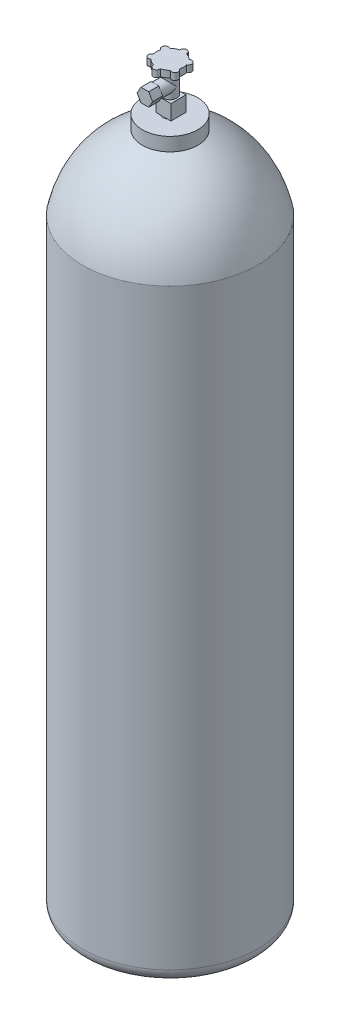
ISO-10303-21;
HEADER;
FILE_DESCRIPTION(('STEP AP214'),'2;1');
FILE_NAME('part.step','',(''),(''),'','','');
FILE_SCHEMA(('AUTOMOTIVE_DESIGN { 1 0 10303 214 1 1 1 1 }'));
ENDSEC;
DATA;
#1=APPLICATION_CONTEXT('core data for automotive mechanical design processes');
#2=APPLICATION_PROTOCOL_DEFINITION('international standard','automotive_design',2000,#1);
#3=PRODUCT_CONTEXT('',#1,'mechanical');
#4=PRODUCT('Part','Part','',(#3));
#5=PRODUCT_RELATED_PRODUCT_CATEGORY('part','',(#4));
#6=PRODUCT_DEFINITION_FORMATION('','',#4);
#7=PRODUCT_DEFINITION_CONTEXT('part definition',#1,'design');
#8=PRODUCT_DEFINITION('design','',#6,#7);
#9=PRODUCT_DEFINITION_SHAPE('','',#8);
#10=(LENGTH_UNIT() NAMED_UNIT(*) SI_UNIT(.MILLI.,.METRE.));
#11=(NAMED_UNIT(*) PLANE_ANGLE_UNIT() SI_UNIT($,.RADIAN.));
#12=(NAMED_UNIT(*) SI_UNIT($,.STERADIAN.) SOLID_ANGLE_UNIT());
#13=UNCERTAINTY_MEASURE_WITH_UNIT(LENGTH_MEASURE(1.E-05),#10,'distance_accuracy_value','');
#14=(GEOMETRIC_REPRESENTATION_CONTEXT(3) GLOBAL_UNCERTAINTY_ASSIGNED_CONTEXT((#13)) GLOBAL_UNIT_ASSIGNED_CONTEXT((#10,
#11,#12)) REPRESENTATION_CONTEXT('',''));
#15=CARTESIAN_POINT('',(0.,0.,0.));
#16=DIRECTION('',(0.,0.,1.));
#17=DIRECTION('',(1.,0.,0.));
#18=AXIS2_PLACEMENT_3D('',#15,#16,#17);
#19=CARTESIAN_POINT('',(0.,0.,0.));
#20=DIRECTION('',(0.,-1.,0.));
#21=DIRECTION('',(0.,0.,-1.));
#22=AXIS2_PLACEMENT_3D('',#19,#20,#21);
#23=CYLINDRICAL_SURFACE('',#22,12.7);
#24=CARTESIAN_POINT('',(0.,1339.85,0.));
#25=DIRECTION('',(0.,-1.,0.));
#26=DIRECTION('',(0.,0.,-1.));
#27=AXIS2_PLACEMENT_3D('',#24,#25,#26);
#28=CIRCLE('',#27,12.7);
#29=CARTESIAN_POINT('',(-12.7,1339.85,0.));
#30=VERTEX_POINT('',#29);
#31=EDGE_CURVE('E457',#30,#30,#28,.F.);
#32=ORIENTED_EDGE('',*,*,#31,.T.);
#33=EDGE_LOOP('',(#32));
#34=FACE_BOUND('',#33,.T.);
#35=CARTESIAN_POINT('',(0.,1384.3,0.));
#36=DIRECTION('',(0.,-1.,0.));
#37=DIRECTION('',(0.,0.,-1.));
#38=AXIS2_PLACEMENT_3D('',#35,#36,#37);
#39=CIRCLE('',#38,12.6999999999999);
#40=CARTESIAN_POINT('',(0.,1384.3,-12.6999999999999));
#41=VERTEX_POINT('',#40);
#42=EDGE_CURVE('E429',#41,#41,#39,.T.);
#43=ORIENTED_EDGE('',*,*,#42,.T.);
#44=EDGE_LOOP('',(#43));
#45=FACE_BOUND('',#44,.T.);
#46=CARTESIAN_POINT('',(0.,1358.9,0.));
#47=DIRECTION('',(0.,-0.707106781186547,0.707106781186547));
#48=DIRECTION('',(0.,-0.707106781186547,-0.707106781186547));
#49=AXIS2_PLACEMENT_3D('',#46,#47,#48);
#50=ELLIPSE('',#49,17.9605122421383,12.7);
#51=CARTESIAN_POINT('',(-12.7,1358.9,0.));
#52=VERTEX_POINT('',#51);
#53=CARTESIAN_POINT('',(12.7,1358.9,0.));
#54=VERTEX_POINT('',#53);
#55=EDGE_CURVE('E460',#52,#54,#50,.F.);
#56=ORIENTED_EDGE('',*,*,#55,.T.);
#57=CARTESIAN_POINT('',(0.,1358.9,0.));
#58=DIRECTION('',(0.,-0.707106781186547,-0.707106781186547));
#59=DIRECTION('',(0.,-0.707106781186547,0.707106781186547));
#60=AXIS2_PLACEMENT_3D('',#57,#58,#59);
#61=ELLIPSE('',#60,17.9605122421383,12.7);
#62=EDGE_CURVE('E463',#54,#52,#61,.T.);
#63=ORIENTED_EDGE('',*,*,#62,.T.);
#64=EDGE_LOOP('',(#56,#63));
#65=FACE_BOUND('',#64,.T.);
#66=ADVANCED_FACE('F36',(#34,#45,#65),#23,.T.);
#67=CARTESIAN_POINT('',(0.,1308.1,0.));
#68=DIRECTION('',(0.,-1.,0.));
#69=DIRECTION('',(0.,0.,-1.));
#70=AXIS2_PLACEMENT_3D('',#67,#68,#69);
#71=CIRCLE('',#70,12.7);
#72=CARTESIAN_POINT('',(0.,1308.1,-12.7));
#73=VERTEX_POINT('',#72);
#74=EDGE_CURVE('E433',#73,#73,#71,.T.);
#75=ORIENTED_EDGE('',*,*,#74,.F.);
#76=EDGE_LOOP('',(#75));
#77=FACE_BOUND('',#76,.T.);
#78=CARTESIAN_POINT('',(0.,1311.275,0.));
#79=DIRECTION('',(0.,1.,0.));
#80=DIRECTION('',(0.,0.,1.));
#81=AXIS2_PLACEMENT_3D('',#78,#79,#80);
#82=CIRCLE('',#81,12.7);
#83=CARTESIAN_POINT('',(-12.7,1311.275,0.));
#84=VERTEX_POINT('',#83);
#85=EDGE_CURVE('E413',#84,#84,#82,.F.);
#86=ORIENTED_EDGE('',*,*,#85,.T.);
#87=EDGE_LOOP('',(#86));
#88=FACE_BOUND('',#87,.T.);
#89=ADVANCED_FACE('F377',(#77,#88),#23,.T.);
#90=CARTESIAN_POINT('',(12.7,1308.1,0.));
#91=DIRECTION('',(0.,1.,0.));
#92=DIRECTION('',(0.,0.,1.));
#93=AXIS2_PLACEMENT_3D('',#90,#91,#92);
#94=PLANE('',#93);
#95=ORIENTED_EDGE('',*,*,#74,.T.);
#96=EDGE_LOOP('',(#95));
#97=FACE_BOUND('',#96,.T.);
#98=CARTESIAN_POINT('',(0.,1308.1,0.));
#99=DIRECTION('',(0.,-1.,0.));
#100=DIRECTION('',(0.,0.,-1.));
#101=AXIS2_PLACEMENT_3D('',#98,#99,#100);
#102=CIRCLE('',#101,52.3216166566241);
#103=CARTESIAN_POINT('',(0.,1308.1,-52.3216166566241));
#104=VERTEX_POINT('',#103);
#105=EDGE_CURVE('E486',#104,#104,#102,.T.);
#106=ORIENTED_EDGE('',*,*,#105,.F.);
#107=EDGE_LOOP('',(#106));
#108=FACE_BOUND('',#107,.T.);
#109=ADVANCED_FACE('F373',(#97,#108),#94,.T.);
#110=CARTESIAN_POINT('',(0.,0.,0.));
#111=DIRECTION('',(0.,-1.,0.));
#112=DIRECTION('',(0.,0.,-1.));
#113=AXIS2_PLACEMENT_3D('',#110,#111,#112);
#114=CYLINDRICAL_SURFACE('',#113,52.3216166566241);
#115=ORIENTED_EDGE('',*,*,#105,.T.);
#116=EDGE_LOOP('',(#115));
#117=FACE_BOUND('',#116,.T.);
#118=CARTESIAN_POINT('',(0.,1282.7,0.));
#119=DIRECTION('',(0.,-1.,0.));
#120=DIRECTION('',(0.,0.,-1.));
#121=AXIS2_PLACEMENT_3D('',#118,#119,#120);
#122=CIRCLE('',#121,52.3216166566241);
#123=CARTESIAN_POINT('',(0.,1282.7,-52.3216166566241));
#124=VERTEX_POINT('',#123);
#125=EDGE_CURVE('E484',#124,#124,#122,.T.);
#126=ORIENTED_EDGE('',*,*,#125,.F.);
#127=EDGE_LOOP('',(#126));
#128=FACE_BOUND('',#127,.T.);
#129=ADVANCED_FACE('F368',(#117,#128),#114,.T.);
#130=CARTESIAN_POINT('',(165.1,1143.,0.));
#131=CARTESIAN_POINT('',(143.698147325174,1240.08378947044,0.));
#132=CARTESIAN_POINT('',(52.3216166566241,1282.7,0.));
#133=B_SPLINE_CURVE_WITH_KNOTS('',2,(#130,#131,#132),.UNSPECIFIED.,.F.,.F.,(3,3),(0.,1.),.UNSPECIFIED.);
#134=CARTESIAN_POINT('',(0.,0.,0.));
#135=DIRECTION('',(0.,-1.,0.));
#136=AXIS1_PLACEMENT('',#134,#135);
#137=SURFACE_OF_REVOLUTION('',#133,#136);
#138=ORIENTED_EDGE('',*,*,#125,.T.);
#139=EDGE_LOOP('',(#138));
#140=FACE_BOUND('',#139,.T.);
#141=CARTESIAN_POINT('',(0.,1143.,0.));
#142=DIRECTION('',(0.,-1.,0.));
#143=DIRECTION('',(0.,0.,-1.));
#144=AXIS2_PLACEMENT_3D('',#141,#142,#143);
#145=CIRCLE('',#144,165.1);
#146=CARTESIAN_POINT('',(0.,1143.,-165.1));
#147=VERTEX_POINT('',#146);
#148=EDGE_CURVE('E321',#147,#147,#145,.T.);
#149=ORIENTED_EDGE('',*,*,#148,.F.);
#150=EDGE_LOOP('',(#149));
#151=FACE_BOUND('',#150,.T.);
#152=ADVANCED_FACE('F363',(#140,#151),#137,.F.);
#153=CARTESIAN_POINT('',(0.,0.,0.));
#154=DIRECTION('',(0.,-1.,0.));
#155=DIRECTION('',(0.,0.,-1.));
#156=AXIS2_PLACEMENT_3D('',#153,#154,#155);
#157=CYLINDRICAL_SURFACE('',#156,165.1);
#158=CARTESIAN_POINT('',(0.,25.4,0.));
#159=DIRECTION('',(0.,-1.,0.));
#160=DIRECTION('',(0.,0.,-1.));
#161=AXIS2_PLACEMENT_3D('',#158,#159,#160);
#162=CIRCLE('',#161,165.1);
#163=CARTESIAN_POINT('',(0.,25.4,-165.1));
#164=VERTEX_POINT('',#163);
#165=EDGE_CURVE('E11',#164,#164,#162,.F.);
#166=ORIENTED_EDGE('',*,*,#165,.T.);
#167=EDGE_LOOP('',(#166));
#168=FACE_BOUND('',#167,.T.);
#169=ORIENTED_EDGE('',*,*,#148,.T.);
#170=EDGE_LOOP('',(#169));
#171=FACE_BOUND('',#170,.T.);
#172=ADVANCED_FACE('F367',(#168,#171),#157,.T.);
#173=CARTESIAN_POINT('',(0.,0.,0.));
#174=DIRECTION('',(0.,-1.,0.));
#175=DIRECTION('',(0.,0.,-1.));
#176=AXIS2_PLACEMENT_3D('',#173,#174,#175);
#177=PLANE('',#176);
#178=CARTESIAN_POINT('',(0.,0.,0.));
#179=DIRECTION('',(0.,-1.,0.));
#180=DIRECTION('',(0.,0.,-1.));
#181=AXIS2_PLACEMENT_3D('',#178,#179,#180);
#182=CIRCLE('',#181,139.7);
#183=CARTESIAN_POINT('',(0.,0.,-139.7));
#184=VERTEX_POINT('',#183);
#185=EDGE_CURVE('E44',#184,#184,#182,.T.);
#186=ORIENTED_EDGE('',*,*,#185,.T.);
#187=EDGE_LOOP('',(#186));
#188=FACE_BOUND('',#187,.T.);
#189=ADVANCED_FACE('F468',(#188),#177,.T.);
#190=CARTESIAN_POINT('',(-12.7,0.,0.));
#191=DIRECTION('',(-1.,0.,0.));
#192=DIRECTION('',(0.,0.,1.));
#193=AXIS2_PLACEMENT_3D('',#190,#191,#192);
#194=PLANE('',#193);
#195=DIRECTION('',(0.,0.,1.));
#196=VECTOR('',#195,1.);
#197=CARTESIAN_POINT('',(-12.7,1339.85,14.2875));
#198=LINE('',#197,#196);
#199=CARTESIAN_POINT('',(-12.7,1339.85,14.2875));
#200=VERTEX_POINT('',#199);
#201=EDGE_CURVE('E263',#30,#200,#198,.T.);
#202=ORIENTED_EDGE('',*,*,#201,.F.);
#203=CARTESIAN_POINT('',(-12.7,1339.85,-14.2875));
#204=VERTEX_POINT('',#203);
#205=EDGE_CURVE('E264',#204,#30,#198,.T.);
#206=ORIENTED_EDGE('',*,*,#205,.F.);
#207=DIRECTION('',(0.,1.,0.));
#208=VECTOR('',#207,1.);
#209=CARTESIAN_POINT('',(-12.7,1311.275,-14.2875));
#210=LINE('',#209,#208);
#211=CARTESIAN_POINT('',(-12.7,1311.275,-14.2875));
#212=VERTEX_POINT('',#211);
#213=EDGE_CURVE('E248',#212,#204,#210,.T.);
#214=ORIENTED_EDGE('',*,*,#213,.F.);
#215=DIRECTION('',(0.,0.,-1.));
#216=VECTOR('',#215,1.);
#217=CARTESIAN_POINT('',(-12.7,1311.275,14.2875));
#218=LINE('',#217,#216);
#219=EDGE_CURVE('E268',#84,#212,#218,.T.);
#220=ORIENTED_EDGE('',*,*,#219,.F.);
#221=CARTESIAN_POINT('',(-12.7,1311.275,14.2875));
#222=VERTEX_POINT('',#221);
#223=EDGE_CURVE('E254',#222,#84,#218,.T.);
#224=ORIENTED_EDGE('',*,*,#223,.F.);
#225=DIRECTION('',(0.,-1.,0.));
#226=VECTOR('',#225,1.);
#227=CARTESIAN_POINT('',(-12.7,1311.275,14.2875));
#228=LINE('',#227,#226);
#229=EDGE_CURVE('E266',#200,#222,#228,.T.);
#230=ORIENTED_EDGE('',*,*,#229,.F.);
#231=EDGE_LOOP('',(#202,#206,#214,#220,#224,#230));
#232=FACE_BOUND('',#231,.T.);
#233=ADVANCED_FACE('F508',(#232),#194,.T.);
#234=CARTESIAN_POINT('',(15.875,1311.275,-14.2875));
#235=DIRECTION('',(0.,0.,1.));
#236=DIRECTION('',(1.,0.,0.));
#237=AXIS2_PLACEMENT_3D('',#234,#235,#236);
#238=PLANE('',#237);
#239=ORIENTED_EDGE('',*,*,#213,.T.);
#240=DIRECTION('',(-1.,0.,0.));
#241=VECTOR('',#240,1.);
#242=CARTESIAN_POINT('',(15.875,1339.85,-14.2875));
#243=LINE('',#242,#241);
#244=CARTESIAN_POINT('',(15.875,1339.85,-14.2875));
#245=VERTEX_POINT('',#244);
#246=EDGE_CURVE('E278',#245,#204,#243,.T.);
#247=ORIENTED_EDGE('',*,*,#246,.F.);
#248=DIRECTION('',(0.,1.,0.));
#249=VECTOR('',#248,1.);
#250=CARTESIAN_POINT('',(15.875,1311.275,-14.2875));
#251=LINE('',#250,#249);
#252=CARTESIAN_POINT('',(15.875,1311.275,-14.2875));
#253=VERTEX_POINT('',#252);
#254=EDGE_CURVE('E250',#253,#245,#251,.T.);
#255=ORIENTED_EDGE('',*,*,#254,.F.);
#256=DIRECTION('',(-1.,0.,0.));
#257=VECTOR('',#256,1.);
#258=CARTESIAN_POINT('',(15.875,1311.275,-14.2875));
#259=LINE('',#258,#257);
#260=EDGE_CURVE('E260',#253,#212,#259,.T.);
#261=ORIENTED_EDGE('',*,*,#260,.T.);
#262=EDGE_LOOP('',(#239,#247,#255,#261));
#263=FACE_BOUND('',#262,.T.);
#264=ADVANCED_FACE('F511',(#263),#238,.F.);
#265=CARTESIAN_POINT('',(15.875,1339.85,14.2875));
#266=DIRECTION('',(0.,-1.,0.));
#267=DIRECTION('',(0.,0.,-1.));
#268=AXIS2_PLACEMENT_3D('',#265,#266,#267);
#269=PLANE('',#268);
#270=ORIENTED_EDGE('',*,*,#205,.T.);
#271=ORIENTED_EDGE('',*,*,#31,.F.);
#272=ORIENTED_EDGE('',*,*,#201,.T.);
#273=DIRECTION('',(-1.,0.,0.));
#274=VECTOR('',#273,1.);
#275=CARTESIAN_POINT('',(15.875,1339.85,14.2875));
#276=LINE('',#275,#274);
#277=CARTESIAN_POINT('',(15.875,1339.85,14.2875));
#278=VERTEX_POINT('',#277);
#279=EDGE_CURVE('E275',#278,#200,#276,.T.);
#280=ORIENTED_EDGE('',*,*,#279,.F.);
#281=DIRECTION('',(0.,0.,1.));
#282=VECTOR('',#281,1.);
#283=CARTESIAN_POINT('',(15.875,1339.85,14.2875));
#284=LINE('',#283,#282);
#285=EDGE_CURVE('E253',#245,#278,#284,.T.);
#286=ORIENTED_EDGE('',*,*,#285,.F.);
#287=ORIENTED_EDGE('',*,*,#246,.T.);
#288=EDGE_LOOP('',(#270,#271,#272,#280,#286,#287));
#289=FACE_BOUND('',#288,.T.);
#290=ADVANCED_FACE('F519',(#289),#269,.F.);
#291=CARTESIAN_POINT('',(15.875,1311.275,14.2875));
#292=DIRECTION('',(0.,0.,-1.));
#293=DIRECTION('',(-1.,0.,0.));
#294=AXIS2_PLACEMENT_3D('',#291,#292,#293);
#295=PLANE('',#294);
#296=ORIENTED_EDGE('',*,*,#229,.T.);
#297=DIRECTION('',(-1.,0.,0.));
#298=VECTOR('',#297,1.);
#299=CARTESIAN_POINT('',(15.875,1311.275,14.2875));
#300=LINE('',#299,#298);
#301=CARTESIAN_POINT('',(15.875,1311.275,14.2875));
#302=VERTEX_POINT('',#301);
#303=EDGE_CURVE('E272',#302,#222,#300,.T.);
#304=ORIENTED_EDGE('',*,*,#303,.F.);
#305=DIRECTION('',(0.,-1.,0.));
#306=VECTOR('',#305,1.);
#307=CARTESIAN_POINT('',(15.875,1311.275,14.2875));
#308=LINE('',#307,#306);
#309=EDGE_CURVE('E256',#278,#302,#308,.T.);
#310=ORIENTED_EDGE('',*,*,#309,.F.);
#311=ORIENTED_EDGE('',*,*,#279,.T.);
#312=EDGE_LOOP('',(#296,#304,#310,#311));
#313=FACE_BOUND('',#312,.T.);
#314=ADVANCED_FACE('F516',(#313),#295,.F.);
#315=CARTESIAN_POINT('',(15.875,1311.275,14.2875));
#316=DIRECTION('',(0.,1.,0.));
#317=DIRECTION('',(0.,0.,1.));
#318=AXIS2_PLACEMENT_3D('',#315,#316,#317);
#319=PLANE('',#318);
#320=ORIENTED_EDGE('',*,*,#223,.T.);
#321=ORIENTED_EDGE('',*,*,#85,.F.);
#322=ORIENTED_EDGE('',*,*,#219,.T.);
#323=ORIENTED_EDGE('',*,*,#260,.F.);
#324=DIRECTION('',(0.,0.,-1.));
#325=VECTOR('',#324,1.);
#326=CARTESIAN_POINT('',(15.875,1311.275,14.2875));
#327=LINE('',#326,#325);
#328=EDGE_CURVE('E258',#302,#253,#327,.T.);
#329=ORIENTED_EDGE('',*,*,#328,.F.);
#330=ORIENTED_EDGE('',*,*,#303,.T.);
#331=EDGE_LOOP('',(#320,#321,#322,#323,#329,#330));
#332=FACE_BOUND('',#331,.T.);
#333=ADVANCED_FACE('F406',(#332),#319,.F.);
#334=CARTESIAN_POINT('',(15.875,0.,0.));
#335=DIRECTION('',(-1.,0.,0.));
#336=DIRECTION('',(0.,0.,1.));
#337=AXIS2_PLACEMENT_3D('',#334,#335,#336);
#338=PLANE('',#337);
#339=ORIENTED_EDGE('',*,*,#254,.T.);
#340=ORIENTED_EDGE('',*,*,#285,.T.);
#341=ORIENTED_EDGE('',*,*,#309,.T.);
#342=ORIENTED_EDGE('',*,*,#328,.T.);
#343=EDGE_LOOP('',(#339,#340,#341,#342));
#344=FACE_BOUND('',#343,.T.);
#345=ADVANCED_FACE('F398',(#344),#338,.F.);
#346=CARTESIAN_POINT('',(0.,1397.,0.));
#347=DIRECTION('',(0.,1.,0.));
#348=DIRECTION('',(0.,0.,1.));
#349=AXIS2_PLACEMENT_3D('',#346,#347,#348);
#350=PLANE('',#349);
#351=CARTESIAN_POINT('',(0.,1397.,0.));
#352=DIRECTION('',(0.,-1.,0.));
#353=DIRECTION('',(0.,0.,-1.));
#354=AXIS2_PLACEMENT_3D('',#351,#352,#353);
#355=CIRCLE('',#354,25.3999999999999);
#356=CARTESIAN_POINT('',(6.30019530947256,1397.,-24.60625));
#357=VERTEX_POINT('',#356);
#358=CARTESIAN_POINT('',(18.1595399371339,1397.,-17.7592541868074));
#359=VERTEX_POINT('',#358);
#360=EDGE_CURVE('E409',#357,#359,#355,.T.);
#361=ORIENTED_EDGE('',*,*,#360,.F.);
#362=CARTESIAN_POINT('',(0.,1397.,-25.4));
#363=DIRECTION('',(0.,1.,0.));
#364=DIRECTION('',(0.,0.,1.));
#365=AXIS2_PLACEMENT_3D('',#362,#363,#364);
#366=CIRCLE('',#365,6.35);
#367=CARTESIAN_POINT('',(-6.30019530947255,1397.,-24.6062499999999));
#368=VERTEX_POINT('',#367);
#369=EDGE_CURVE('E313',#357,#368,#366,.T.);
#370=ORIENTED_EDGE('',*,*,#369,.T.);
#371=CARTESIAN_POINT('',(-18.1595399371341,1397.,-17.7592541868072));
#372=VERTEX_POINT('',#371);
#373=EDGE_CURVE('E416',#372,#368,#355,.T.);
#374=ORIENTED_EDGE('',*,*,#373,.F.);
#375=CARTESIAN_POINT('',(-21.9970452561241,1397.,-12.7000000000002));
#376=DIRECTION('',(0.,1.,0.));
#377=DIRECTION('',(0.,0.,1.));
#378=AXIS2_PLACEMENT_3D('',#375,#376,#377);
#379=CIRCLE('',#378,6.35000000000003);
#380=CARTESIAN_POINT('',(-24.459735246607,1397.,-6.84699581319361));
#381=VERTEX_POINT('',#380);
#382=EDGE_CURVE('E286',#372,#381,#379,.T.);
#383=ORIENTED_EDGE('',*,*,#382,.T.);
#384=CARTESIAN_POINT('',(-24.4597352466073,1397.,6.84699581319266));
#385=VERTEX_POINT('',#384);
#386=EDGE_CURVE('E437',#385,#381,#355,.T.);
#387=ORIENTED_EDGE('',*,*,#386,.F.);
#388=CARTESIAN_POINT('',(-21.9970452561239,1397.,12.699999999999));
#389=DIRECTION('',(0.,1.,0.));
#390=DIRECTION('',(0.,0.,1.));
#391=AXIS2_PLACEMENT_3D('',#388,#389,#390);
#392=CIRCLE('',#391,6.35);
#393=CARTESIAN_POINT('',(-18.1595399371347,1397.,17.7592541868066));
#394=VERTEX_POINT('',#393);
#395=EDGE_CURVE('E281',#385,#394,#392,.T.);
#396=ORIENTED_EDGE('',*,*,#395,.T.);
#397=CARTESIAN_POINT('',(-6.30019530947255,1397.,24.60625));
#398=VERTEX_POINT('',#397);
#399=EDGE_CURVE('E452',#398,#394,#355,.T.);
#400=ORIENTED_EDGE('',*,*,#399,.F.);
#401=CARTESIAN_POINT('',(2.76647351676973E-13,1397.,25.3999999999986));
#402=DIRECTION('',(0.,1.,0.));
#403=DIRECTION('',(0.,0.,1.));
#404=AXIS2_PLACEMENT_3D('',#401,#402,#403);
#405=CIRCLE('',#404,6.3500000000001);
#406=CARTESIAN_POINT('',(6.30019530947309,1397.,24.6062499999998));
#407=VERTEX_POINT('',#406);
#408=EDGE_CURVE('E304',#398,#407,#405,.T.);
#409=ORIENTED_EDGE('',*,*,#408,.T.);
#410=CARTESIAN_POINT('',(18.1595399371349,1397.,17.7592541868064));
#411=VERTEX_POINT('',#410);
#412=EDGE_CURVE('E453',#411,#407,#355,.T.);
#413=ORIENTED_EDGE('',*,*,#412,.F.);
#414=CARTESIAN_POINT('',(21.9970452561243,1397.,12.6999999999988));
#415=DIRECTION('',(0.,1.,0.));
#416=DIRECTION('',(0.,0.,1.));
#417=AXIS2_PLACEMENT_3D('',#414,#415,#416);
#418=CIRCLE('',#417,6.35000000000019);
#419=CARTESIAN_POINT('',(24.4597352466074,1397.,6.84699581319208));
#420=VERTEX_POINT('',#419);
#421=EDGE_CURVE('E307',#411,#420,#418,.T.);
#422=ORIENTED_EDGE('',*,*,#421,.T.);
#423=CARTESIAN_POINT('',(24.459735246607,1397.,-6.84699581319368));
#424=VERTEX_POINT('',#423);
#425=EDGE_CURVE('E414',#424,#420,#355,.T.);
#426=ORIENTED_EDGE('',*,*,#425,.F.);
#427=CARTESIAN_POINT('',(21.9970452561242,1397.,-12.7000000000005));
#428=DIRECTION('',(0.,1.,0.));
#429=DIRECTION('',(0.,0.,1.));
#430=AXIS2_PLACEMENT_3D('',#427,#428,#429);
#431=CIRCLE('',#430,6.35000000000016);
#432=EDGE_CURVE('E310',#424,#359,#431,.T.);
#433=ORIENTED_EDGE('',*,*,#432,.T.);
#434=EDGE_LOOP('',(#361,#370,#374,#383,#387,#396,#400,#409,#413,#422,#426,#433));
#435=FACE_BOUND('',#434,.T.);
#436=ADVANCED_FACE('F395',(#435),#350,.T.);
#437=CARTESIAN_POINT('',(0.,1384.3,-25.4));
#438=DIRECTION('',(0.,1.,0.));
#439=DIRECTION('',(0.,0.,1.));
#440=AXIS2_PLACEMENT_3D('',#437,#438,#439);
#441=CYLINDRICAL_SURFACE('',#440,6.35);
#442=ORIENTED_EDGE('',*,*,#369,.F.);
#443=DIRECTION('',(0.,1.,0.));
#444=VECTOR('',#443,1.);
#445=CARTESIAN_POINT('',(6.30019530947256,1384.3,-24.60625));
#446=LINE('',#445,#444);
#447=CARTESIAN_POINT('',(6.30019530947254,1384.3,-24.6062499999999));
#448=VERTEX_POINT('',#447);
#449=EDGE_CURVE('E328',#448,#357,#446,.T.);
#450=ORIENTED_EDGE('',*,*,#449,.F.);
#451=CARTESIAN_POINT('',(0.,1384.3,-25.4));
#452=DIRECTION('',(0.,1.,0.));
#453=DIRECTION('',(0.,0.,1.));
#454=AXIS2_PLACEMENT_3D('',#451,#452,#453);
#455=CIRCLE('',#454,6.35);
#456=CARTESIAN_POINT('',(-6.30019530947255,1384.3,-24.6062499999999));
#457=VERTEX_POINT('',#456);
#458=EDGE_CURVE('E295',#448,#457,#455,.T.);
#459=ORIENTED_EDGE('',*,*,#458,.T.);
#460=DIRECTION('',(0.,1.,0.));
#461=VECTOR('',#460,1.);
#462=CARTESIAN_POINT('',(-6.30019530947256,1384.3,-24.60625));
#463=LINE('',#462,#461);
#464=EDGE_CURVE('E325',#457,#368,#463,.T.);
#465=ORIENTED_EDGE('',*,*,#464,.T.);
#466=EDGE_LOOP('',(#442,#450,#459,#465));
#467=FACE_BOUND('',#466,.T.);
#468=ADVANCED_FACE('F397',(#467),#441,.T.);
#469=CARTESIAN_POINT('',(0.,0.,0.));
#470=DIRECTION('',(0.,-1.,0.));
#471=DIRECTION('',(0.,0.,-1.));
#472=AXIS2_PLACEMENT_3D('',#469,#470,#471);
#473=CYLINDRICAL_SURFACE('',#472,25.3999999999999);
#474=DIRECTION('',(0.,1.,0.));
#475=VECTOR('',#474,1.);
#476=CARTESIAN_POINT('',(-18.1595399371341,1384.3,-17.7592541868072));
#477=LINE('',#476,#475);
#478=CARTESIAN_POINT('',(-18.1595399371341,1384.3,-17.7592541868072));
#479=VERTEX_POINT('',#478);
#480=EDGE_CURVE('E322',#479,#372,#477,.T.);
#481=ORIENTED_EDGE('',*,*,#480,.T.);
#482=ORIENTED_EDGE('',*,*,#373,.T.);
#483=ORIENTED_EDGE('',*,*,#464,.F.);
#484=CARTESIAN_POINT('',(0.,1384.3,0.));
#485=DIRECTION('',(0.,-1.,0.));
#486=DIRECTION('',(0.,0.,-1.));
#487=AXIS2_PLACEMENT_3D('',#484,#485,#486);
#488=CIRCLE('',#487,25.3999999999999);
#489=EDGE_CURVE('E423',#479,#457,#488,.T.);
#490=ORIENTED_EDGE('',*,*,#489,.F.);
#491=EDGE_LOOP('',(#481,#482,#483,#490));
#492=FACE_BOUND('',#491,.T.);
#493=ADVANCED_FACE('F393',(#492),#473,.T.);
#494=CARTESIAN_POINT('',(-21.9970452561241,1384.3,-12.7000000000002));
#495=DIRECTION('',(0.,1.,0.));
#496=DIRECTION('',(0.,0.,1.));
#497=AXIS2_PLACEMENT_3D('',#494,#495,#496);
#498=CYLINDRICAL_SURFACE('',#497,6.35000000000003);
#499=ORIENTED_EDGE('',*,*,#382,.F.);
#500=ORIENTED_EDGE('',*,*,#480,.F.);
#501=CARTESIAN_POINT('',(-21.9970452561241,1384.3,-12.7000000000002));
#502=DIRECTION('',(0.,1.,0.));
#503=DIRECTION('',(0.,0.,1.));
#504=AXIS2_PLACEMENT_3D('',#501,#502,#503);
#505=CIRCLE('',#504,6.35000000000003);
#506=CARTESIAN_POINT('',(-24.459735246607,1384.3,-6.84699581319362));
#507=VERTEX_POINT('',#506);
#508=EDGE_CURVE('E298',#479,#507,#505,.T.);
#509=ORIENTED_EDGE('',*,*,#508,.T.);
#510=DIRECTION('',(0.,1.,0.));
#511=VECTOR('',#510,1.);
#512=CARTESIAN_POINT('',(-24.459735246607,1384.3,-6.84699581319363));
#513=LINE('',#512,#511);
#514=EDGE_CURVE('E318',#507,#381,#513,.T.);
#515=ORIENTED_EDGE('',*,*,#514,.T.);
#516=EDGE_LOOP('',(#499,#500,#509,#515));
#517=FACE_BOUND('',#516,.T.);
#518=ADVANCED_FACE('F391',(#517),#498,.T.);
#519=ORIENTED_EDGE('',*,*,#514,.F.);
#520=CARTESIAN_POINT('',(-24.4597352466072,1384.3,6.84699581319262));
#521=VERTEX_POINT('',#520);
#522=EDGE_CURVE('E428',#521,#507,#488,.T.);
#523=ORIENTED_EDGE('',*,*,#522,.F.);
#524=DIRECTION('',(0.,1.,0.));
#525=VECTOR('',#524,1.);
#526=CARTESIAN_POINT('',(-24.4597352466073,1384.3,6.84699581319266));
#527=LINE('',#526,#525);
#528=EDGE_CURVE('E301',#521,#385,#527,.T.);
#529=ORIENTED_EDGE('',*,*,#528,.T.);
#530=ORIENTED_EDGE('',*,*,#386,.T.);
#531=EDGE_LOOP('',(#519,#523,#529,#530));
#532=FACE_BOUND('',#531,.T.);
#533=ADVANCED_FACE('F388',(#532),#473,.T.);
#534=CARTESIAN_POINT('',(-21.9970452561239,1384.3,12.699999999999));
#535=DIRECTION('',(0.,1.,0.));
#536=DIRECTION('',(0.,0.,1.));
#537=AXIS2_PLACEMENT_3D('',#534,#535,#536);
#538=CYLINDRICAL_SURFACE('',#537,6.35);
#539=ORIENTED_EDGE('',*,*,#395,.F.);
#540=ORIENTED_EDGE('',*,*,#528,.F.);
#541=CARTESIAN_POINT('',(-21.9970452561239,1384.3,12.699999999999));
#542=DIRECTION('',(0.,1.,0.));
#543=DIRECTION('',(0.,0.,1.));
#544=AXIS2_PLACEMENT_3D('',#541,#542,#543);
#545=CIRCLE('',#544,6.35);
#546=CARTESIAN_POINT('',(-18.1595399371347,1384.3,17.7592541868066));
#547=VERTEX_POINT('',#546);
#548=EDGE_CURVE('E282',#521,#547,#545,.T.);
#549=ORIENTED_EDGE('',*,*,#548,.T.);
#550=DIRECTION('',(0.,1.,0.));
#551=VECTOR('',#550,1.);
#552=CARTESIAN_POINT('',(-18.1595399371347,1384.3,17.7592541868066));
#553=LINE('',#552,#551);
#554=EDGE_CURVE('E349',#547,#394,#553,.T.);
#555=ORIENTED_EDGE('',*,*,#554,.T.);
#556=EDGE_LOOP('',(#539,#540,#549,#555));
#557=FACE_BOUND('',#556,.T.);
#558=ADVANCED_FACE('F390',(#557),#538,.T.);
#559=DIRECTION('',(0.,1.,0.));
#560=VECTOR('',#559,1.);
#561=CARTESIAN_POINT('',(-6.30019530947255,1384.3,24.60625));
#562=LINE('',#561,#560);
#563=CARTESIAN_POINT('',(-6.30019530947255,1384.3,24.6062499999999));
#564=VERTEX_POINT('',#563);
#565=EDGE_CURVE('E346',#564,#398,#562,.T.);
#566=ORIENTED_EDGE('',*,*,#565,.T.);
#567=ORIENTED_EDGE('',*,*,#399,.T.);
#568=ORIENTED_EDGE('',*,*,#554,.F.);
#569=EDGE_CURVE('E431',#564,#547,#488,.T.);
#570=ORIENTED_EDGE('',*,*,#569,.F.);
#571=EDGE_LOOP('',(#566,#567,#568,#570));
#572=FACE_BOUND('',#571,.T.);
#573=ADVANCED_FACE('F394',(#572),#473,.T.);
#574=CARTESIAN_POINT('',(2.76647351676973E-13,1384.3,25.3999999999986));
#575=DIRECTION('',(0.,1.,0.));
#576=DIRECTION('',(0.,0.,1.));
#577=AXIS2_PLACEMENT_3D('',#574,#575,#576);
#578=CYLINDRICAL_SURFACE('',#577,6.3500000000001);
#579=ORIENTED_EDGE('',*,*,#408,.F.);
#580=ORIENTED_EDGE('',*,*,#565,.F.);
#581=CARTESIAN_POINT('',(2.76647351676973E-13,1384.3,25.3999999999986));
#582=DIRECTION('',(0.,1.,0.));
#583=DIRECTION('',(0.,0.,1.));
#584=AXIS2_PLACEMENT_3D('',#581,#582,#583);
#585=CIRCLE('',#584,6.3500000000001);
#586=CARTESIAN_POINT('',(6.30019530947308,1384.3,24.6062499999998));
#587=VERTEX_POINT('',#586);
#588=EDGE_CURVE('E285',#564,#587,#585,.T.);
#589=ORIENTED_EDGE('',*,*,#588,.T.);
#590=DIRECTION('',(0.,1.,0.));
#591=VECTOR('',#590,1.);
#592=CARTESIAN_POINT('',(6.300195309473,1384.3,24.6062499999999));
#593=LINE('',#592,#591);
#594=EDGE_CURVE('E343',#587,#407,#593,.T.);
#595=ORIENTED_EDGE('',*,*,#594,.T.);
#596=EDGE_LOOP('',(#579,#580,#589,#595));
#597=FACE_BOUND('',#596,.T.);
#598=ADVANCED_FACE('F624',(#597),#578,.T.);
#599=DIRECTION('',(0.,1.,0.));
#600=VECTOR('',#599,1.);
#601=CARTESIAN_POINT('',(18.1595399371349,1384.3,17.7592541868064));
#602=LINE('',#601,#600);
#603=CARTESIAN_POINT('',(18.1595399371349,1384.3,17.7592541868064));
#604=VERTEX_POINT('',#603);
#605=EDGE_CURVE('E340',#604,#411,#602,.T.);
#606=ORIENTED_EDGE('',*,*,#605,.T.);
#607=ORIENTED_EDGE('',*,*,#412,.T.);
#608=ORIENTED_EDGE('',*,*,#594,.F.);
#609=EDGE_CURVE('E439',#604,#587,#488,.T.);
#610=ORIENTED_EDGE('',*,*,#609,.F.);
#611=EDGE_LOOP('',(#606,#607,#608,#610));
#612=FACE_BOUND('',#611,.T.);
#613=ADVANCED_FACE('F622',(#612),#473,.T.);
#614=CARTESIAN_POINT('',(21.9970452561243,1384.3,12.6999999999988));
#615=DIRECTION('',(0.,1.,0.));
#616=DIRECTION('',(0.,0.,1.));
#617=AXIS2_PLACEMENT_3D('',#614,#615,#616);
#618=CYLINDRICAL_SURFACE('',#617,6.35000000000019);
#619=ORIENTED_EDGE('',*,*,#421,.F.);
#620=ORIENTED_EDGE('',*,*,#605,.F.);
#621=CARTESIAN_POINT('',(21.9970452561243,1384.3,12.6999999999988));
#622=DIRECTION('',(0.,1.,0.));
#623=DIRECTION('',(0.,0.,1.));
#624=AXIS2_PLACEMENT_3D('',#621,#622,#623);
#625=CIRCLE('',#624,6.35000000000019);
#626=CARTESIAN_POINT('',(24.4597352466074,1384.3,6.84699581319209));
#627=VERTEX_POINT('',#626);
#628=EDGE_CURVE('E289',#604,#627,#625,.T.);
#629=ORIENTED_EDGE('',*,*,#628,.T.);
#630=DIRECTION('',(0.,1.,0.));
#631=VECTOR('',#630,1.);
#632=CARTESIAN_POINT('',(24.4597352466074,1384.3,6.84699581319228));
#633=LINE('',#632,#631);
#634=EDGE_CURVE('E337',#627,#420,#633,.T.);
#635=ORIENTED_EDGE('',*,*,#634,.T.);
#636=EDGE_LOOP('',(#619,#620,#629,#635));
#637=FACE_BOUND('',#636,.T.);
#638=ADVANCED_FACE('F619',(#637),#618,.T.);
#639=DIRECTION('',(0.,1.,0.));
#640=VECTOR('',#639,1.);
#641=CARTESIAN_POINT('',(24.459735246607,1384.3,-6.84699581319368));
#642=LINE('',#641,#640);
#643=CARTESIAN_POINT('',(24.4597352466069,1384.3,-6.84699581319367));
#644=VERTEX_POINT('',#643);
#645=EDGE_CURVE('E334',#644,#424,#642,.T.);
#646=ORIENTED_EDGE('',*,*,#645,.T.);
#647=ORIENTED_EDGE('',*,*,#425,.T.);
#648=ORIENTED_EDGE('',*,*,#634,.F.);
#649=EDGE_CURVE('E435',#644,#627,#488,.T.);
#650=ORIENTED_EDGE('',*,*,#649,.F.);
#651=EDGE_LOOP('',(#646,#647,#648,#650));
#652=FACE_BOUND('',#651,.T.);
#653=ADVANCED_FACE('F617',(#652),#473,.T.);
#654=CARTESIAN_POINT('',(21.9970452561242,1384.3,-12.7000000000005));
#655=DIRECTION('',(0.,1.,0.));
#656=DIRECTION('',(0.,0.,1.));
#657=AXIS2_PLACEMENT_3D('',#654,#655,#656);
#658=CYLINDRICAL_SURFACE('',#657,6.35000000000016);
#659=ORIENTED_EDGE('',*,*,#432,.F.);
#660=ORIENTED_EDGE('',*,*,#645,.F.);
#661=CARTESIAN_POINT('',(21.9970452561242,1384.3,-12.7000000000005));
#662=DIRECTION('',(0.,1.,0.));
#663=DIRECTION('',(0.,0.,1.));
#664=AXIS2_PLACEMENT_3D('',#661,#662,#663);
#665=CIRCLE('',#664,6.35000000000016);
#666=CARTESIAN_POINT('',(18.1595399371339,1384.3,-17.7592541868074));
#667=VERTEX_POINT('',#666);
#668=EDGE_CURVE('E292',#644,#667,#665,.T.);
#669=ORIENTED_EDGE('',*,*,#668,.T.);
#670=DIRECTION('',(0.,1.,0.));
#671=VECTOR('',#670,1.);
#672=CARTESIAN_POINT('',(18.159539937134,1384.3,-17.7592541868073));
#673=LINE('',#672,#671);
#674=EDGE_CURVE('E331',#667,#359,#673,.T.);
#675=ORIENTED_EDGE('',*,*,#674,.T.);
#676=EDGE_LOOP('',(#659,#660,#669,#675));
#677=FACE_BOUND('',#676,.T.);
#678=ADVANCED_FACE('F614',(#677),#658,.T.);
#679=ORIENTED_EDGE('',*,*,#449,.T.);
#680=ORIENTED_EDGE('',*,*,#360,.T.);
#681=ORIENTED_EDGE('',*,*,#674,.F.);
#682=EDGE_CURVE('E419',#448,#667,#488,.T.);
#683=ORIENTED_EDGE('',*,*,#682,.F.);
#684=EDGE_LOOP('',(#679,#680,#681,#683));
#685=FACE_BOUND('',#684,.T.);
#686=ADVANCED_FACE('F386',(#685),#473,.T.);
#687=CARTESIAN_POINT('',(25.3999999999999,1384.3,0.));
#688=DIRECTION('',(0.,-1.,0.));
#689=DIRECTION('',(0.,0.,-1.));
#690=AXIS2_PLACEMENT_3D('',#687,#688,#689);
#691=PLANE('',#690);
#692=ORIENTED_EDGE('',*,*,#682,.T.);
#693=ORIENTED_EDGE('',*,*,#668,.F.);
#694=ORIENTED_EDGE('',*,*,#649,.T.);
#695=ORIENTED_EDGE('',*,*,#628,.F.);
#696=ORIENTED_EDGE('',*,*,#609,.T.);
#697=ORIENTED_EDGE('',*,*,#588,.F.);
#698=ORIENTED_EDGE('',*,*,#569,.T.);
#699=ORIENTED_EDGE('',*,*,#548,.F.);
#700=ORIENTED_EDGE('',*,*,#522,.T.);
#701=ORIENTED_EDGE('',*,*,#508,.F.);
#702=ORIENTED_EDGE('',*,*,#489,.T.);
#703=ORIENTED_EDGE('',*,*,#458,.F.);
#704=EDGE_LOOP('',(#692,#693,#694,#695,#696,#697,#698,#699,#700,#701,#702,#703));
#705=FACE_BOUND('',#704,.T.);
#706=ORIENTED_EDGE('',*,*,#42,.F.);
#707=EDGE_LOOP('',(#706));
#708=FACE_BOUND('',#707,.T.);
#709=ADVANCED_FACE('F382',(#705,#708),#691,.T.);
#710=CARTESIAN_POINT('',(0.,1358.9,28.575));
#711=DIRECTION('',(0.,0.,-1.));
#712=DIRECTION('',(-1.,0.,0.));
#713=AXIS2_PLACEMENT_3D('',#710,#711,#712);
#714=CYLINDRICAL_SURFACE('',#713,12.7);
#715=ORIENTED_EDGE('',*,*,#62,.F.);
#716=ORIENTED_EDGE('',*,*,#55,.F.);
#717=EDGE_LOOP('',(#715,#716));
#718=FACE_BOUND('',#717,.T.);
#719=CARTESIAN_POINT('',(0.,1358.9,28.575));
#720=DIRECTION('',(0.,0.,1.));
#721=DIRECTION('',(1.,0.,0.));
#722=AXIS2_PLACEMENT_3D('',#719,#720,#721);
#723=CIRCLE('',#722,12.7);
#724=CARTESIAN_POINT('',(10.9985226280624,1365.25,28.575));
#725=VERTEX_POINT('',#724);
#726=CARTESIAN_POINT('',(0.,1371.6,28.575));
#727=VERTEX_POINT('',#726);
#728=EDGE_CURVE('E242',#725,#727,#723,.T.);
#729=ORIENTED_EDGE('',*,*,#728,.F.);
#730=CARTESIAN_POINT('',(10.9985226280623,1352.55,28.575));
#731=VERTEX_POINT('',#730);
#732=EDGE_CURVE('E51',#731,#725,#723,.T.);
#733=ORIENTED_EDGE('',*,*,#732,.F.);
#734=CARTESIAN_POINT('',(0.,1346.2,28.575));
#735=VERTEX_POINT('',#734);
#736=EDGE_CURVE('E55',#735,#731,#723,.T.);
#737=ORIENTED_EDGE('',*,*,#736,.F.);
#738=CARTESIAN_POINT('',(-10.9985226280622,1352.55,28.575));
#739=VERTEX_POINT('',#738);
#740=EDGE_CURVE('E984',#739,#735,#723,.T.);
#741=ORIENTED_EDGE('',*,*,#740,.F.);
#742=CARTESIAN_POINT('',(-10.9985226280624,1365.25,28.575));
#743=VERTEX_POINT('',#742);
#744=EDGE_CURVE('E575',#743,#739,#723,.T.);
#745=ORIENTED_EDGE('',*,*,#744,.F.);
#746=EDGE_CURVE('E249',#727,#743,#723,.T.);
#747=ORIENTED_EDGE('',*,*,#746,.F.);
#748=EDGE_LOOP('',(#729,#733,#737,#741,#745,#747));
#749=FACE_BOUND('',#748,.T.);
#750=ADVANCED_FACE('F385',(#718,#749),#714,.T.);
#751=CARTESIAN_POINT('',(0.,0.,28.575));
#752=DIRECTION('',(0.,0.,1.));
#753=DIRECTION('',(1.,0.,0.));
#754=AXIS2_PLACEMENT_3D('',#751,#752,#753);
#755=PLANE('',#754);
#756=DIRECTION('',(-0.500000000000001,0.866025403784438,0.));
#757=VECTOR('',#756,1.);
#758=CARTESIAN_POINT('',(14.6646968374164,1358.9,28.575));
#759=LINE('',#758,#757);
#760=CARTESIAN_POINT('',(7.33234841870821,1371.6,28.575));
#761=VERTEX_POINT('',#760);
#762=EDGE_CURVE('E535',#725,#761,#759,.T.);
#763=ORIENTED_EDGE('',*,*,#762,.F.);
#764=ORIENTED_EDGE('',*,*,#728,.T.);
#765=DIRECTION('',(-1.,0.,0.));
#766=VECTOR('',#765,1.);
#767=CARTESIAN_POINT('',(7.33234841870821,1371.6,28.575));
#768=LINE('',#767,#766);
#769=EDGE_CURVE('E537',#761,#727,#768,.T.);
#770=ORIENTED_EDGE('',*,*,#769,.F.);
#771=EDGE_LOOP('',(#763,#764,#770));
#772=FACE_BOUND('',#771,.T.);
#773=ADVANCED_FACE('F525',(#772),#755,.F.);
#774=CARTESIAN_POINT('',(-7.33234841870822,1371.6,28.575));
#775=VERTEX_POINT('',#774);
#776=EDGE_CURVE('E540',#727,#775,#768,.T.);
#777=ORIENTED_EDGE('',*,*,#776,.F.);
#778=ORIENTED_EDGE('',*,*,#746,.T.);
#779=DIRECTION('',(-0.499999999999999,-0.866025403784439,0.));
#780=VECTOR('',#779,1.);
#781=CARTESIAN_POINT('',(-7.33234841870822,1371.6,28.575));
#782=LINE('',#781,#780);
#783=EDGE_CURVE('E546',#775,#743,#782,.T.);
#784=ORIENTED_EDGE('',*,*,#783,.F.);
#785=EDGE_LOOP('',(#777,#778,#784));
#786=FACE_BOUND('',#785,.T.);
#787=ADVANCED_FACE('F573',(#786),#755,.F.);
#788=CARTESIAN_POINT('',(-14.6646968374164,1358.9,28.575));
#789=VERTEX_POINT('',#788);
#790=EDGE_CURVE('E545',#743,#789,#782,.T.);
#791=ORIENTED_EDGE('',*,*,#790,.F.);
#792=ORIENTED_EDGE('',*,*,#744,.T.);
#793=DIRECTION('',(0.500000000000001,-0.866025403784438,0.));
#794=VECTOR('',#793,1.);
#795=CARTESIAN_POINT('',(-14.6646968374164,1358.9,28.575));
#796=LINE('',#795,#794);
#797=EDGE_CURVE('E550',#789,#739,#796,.T.);
#798=ORIENTED_EDGE('',*,*,#797,.F.);
#799=EDGE_LOOP('',(#791,#792,#798));
#800=FACE_BOUND('',#799,.T.);
#801=ADVANCED_FACE('F579',(#800),#755,.F.);
#802=CARTESIAN_POINT('',(-7.33234841870819,1346.2,28.575));
#803=VERTEX_POINT('',#802);
#804=EDGE_CURVE('E549',#739,#803,#796,.T.);
#805=ORIENTED_EDGE('',*,*,#804,.F.);
#806=ORIENTED_EDGE('',*,*,#740,.T.);
#807=DIRECTION('',(1.,0.,0.));
#808=VECTOR('',#807,1.);
#809=CARTESIAN_POINT('',(-7.33234841870819,1346.2,28.575));
#810=LINE('',#809,#808);
#811=EDGE_CURVE('E233',#803,#735,#810,.T.);
#812=ORIENTED_EDGE('',*,*,#811,.F.);
#813=EDGE_LOOP('',(#805,#806,#812));
#814=FACE_BOUND('',#813,.T.);
#815=ADVANCED_FACE('F707',(#814),#755,.F.);
#816=CARTESIAN_POINT('',(7.33234841870825,1346.2,28.575));
#817=VERTEX_POINT('',#816);
#818=EDGE_CURVE('E553',#735,#817,#810,.T.);
#819=ORIENTED_EDGE('',*,*,#818,.F.);
#820=ORIENTED_EDGE('',*,*,#736,.T.);
#821=DIRECTION('',(0.499999999999999,0.866025403784439,0.));
#822=VECTOR('',#821,1.);
#823=CARTESIAN_POINT('',(7.33234841870825,1346.2,28.575));
#824=LINE('',#823,#822);
#825=EDGE_CURVE('E538',#817,#731,#824,.T.);
#826=ORIENTED_EDGE('',*,*,#825,.F.);
#827=EDGE_LOOP('',(#819,#820,#826));
#828=FACE_BOUND('',#827,.T.);
#829=ADVANCED_FACE('F715',(#828),#755,.F.);
#830=CARTESIAN_POINT('',(14.6646968374164,1358.9,28.575));
#831=VERTEX_POINT('',#830);
#832=EDGE_CURVE('E238',#731,#831,#824,.T.);
#833=ORIENTED_EDGE('',*,*,#832,.F.);
#834=ORIENTED_EDGE('',*,*,#732,.T.);
#835=EDGE_CURVE('E534',#831,#725,#759,.T.);
#836=ORIENTED_EDGE('',*,*,#835,.F.);
#837=EDGE_LOOP('',(#833,#834,#836));
#838=FACE_BOUND('',#837,.T.);
#839=ADVANCED_FACE('F533',(#838),#755,.F.);
#840=CARTESIAN_POINT('',(7.33234841870825,1346.2,47.625));
#841=DIRECTION('',(-0.866025403784439,0.499999999999999,0.));
#842=DIRECTION('',(-0.499999999999999,-0.866025403784439,0.));
#843=AXIS2_PLACEMENT_3D('',#840,#841,#842);
#844=PLANE('',#843);
#845=ORIENTED_EDGE('',*,*,#825,.T.);
#846=ORIENTED_EDGE('',*,*,#832,.T.);
#847=DIRECTION('',(0.,0.,-1.));
#848=VECTOR('',#847,1.);
#849=CARTESIAN_POINT('',(14.6646968374164,1358.9,47.625));
#850=LINE('',#849,#848);
#851=CARTESIAN_POINT('',(14.6646968374164,1358.9,47.625));
#852=VERTEX_POINT('',#851);
#853=EDGE_CURVE('E218',#852,#831,#850,.T.);
#854=ORIENTED_EDGE('',*,*,#853,.F.);
#855=DIRECTION('',(0.499999999999999,0.866025403784439,0.));
#856=VECTOR('',#855,1.);
#857=CARTESIAN_POINT('',(7.33234841870825,1346.2,47.625));
#858=LINE('',#857,#856);
#859=CARTESIAN_POINT('',(7.33234841870825,1346.2,47.625));
#860=VERTEX_POINT('',#859);
#861=EDGE_CURVE('E224',#860,#852,#858,.T.);
#862=ORIENTED_EDGE('',*,*,#861,.F.);
#863=DIRECTION('',(0.,0.,-1.));
#864=VECTOR('',#863,1.);
#865=CARTESIAN_POINT('',(7.33234841870825,1346.2,47.625));
#866=LINE('',#865,#864);
#867=EDGE_CURVE('E556',#860,#817,#866,.T.);
#868=ORIENTED_EDGE('',*,*,#867,.T.);
#869=EDGE_LOOP('',(#845,#846,#854,#862,#868));
#870=FACE_BOUND('',#869,.T.);
#871=ADVANCED_FACE('F236',(#870),#844,.F.);
#872=CARTESIAN_POINT('',(14.6646968374164,1358.9,47.625));
#873=DIRECTION('',(-0.866025403784438,-0.500000000000001,0.));
#874=DIRECTION('',(0.500000000000001,-0.866025403784438,0.));
#875=AXIS2_PLACEMENT_3D('',#872,#873,#874);
#876=PLANE('',#875);
#877=ORIENTED_EDGE('',*,*,#835,.T.);
#878=ORIENTED_EDGE('',*,*,#762,.T.);
#879=DIRECTION('',(0.,0.,-1.));
#880=VECTOR('',#879,1.);
#881=CARTESIAN_POINT('',(7.33234841870821,1371.6,47.625));
#882=LINE('',#881,#880);
#883=CARTESIAN_POINT('',(7.33234841870821,1371.6,47.625));
#884=VERTEX_POINT('',#883);
#885=EDGE_CURVE('E220',#884,#761,#882,.T.);
#886=ORIENTED_EDGE('',*,*,#885,.F.);
#887=DIRECTION('',(-0.500000000000001,0.866025403784438,0.));
#888=VECTOR('',#887,1.);
#889=CARTESIAN_POINT('',(14.6646968374164,1358.9,47.625));
#890=LINE('',#889,#888);
#891=EDGE_CURVE('E213',#852,#884,#890,.T.);
#892=ORIENTED_EDGE('',*,*,#891,.F.);
#893=ORIENTED_EDGE('',*,*,#853,.T.);
#894=EDGE_LOOP('',(#877,#878,#886,#892,#893));
#895=FACE_BOUND('',#894,.T.);
#896=ADVANCED_FACE('F216',(#895),#876,.F.);
#897=CARTESIAN_POINT('',(7.33234841870821,1371.6,47.625));
#898=DIRECTION('',(0.,-1.,0.));
#899=DIRECTION('',(0.,0.,-1.));
#900=AXIS2_PLACEMENT_3D('',#897,#898,#899);
#901=PLANE('',#900);
#902=ORIENTED_EDGE('',*,*,#769,.T.);
#903=ORIENTED_EDGE('',*,*,#776,.T.);
#904=DIRECTION('',(0.,0.,-1.));
#905=VECTOR('',#904,1.);
#906=CARTESIAN_POINT('',(-7.33234841870822,1371.6,47.625));
#907=LINE('',#906,#905);
#908=CARTESIAN_POINT('',(-7.33234841870822,1371.6,47.625));
#909=VERTEX_POINT('',#908);
#910=EDGE_CURVE('E243',#909,#775,#907,.T.);
#911=ORIENTED_EDGE('',*,*,#910,.F.);
#912=DIRECTION('',(-1.,0.,0.));
#913=VECTOR('',#912,1.);
#914=CARTESIAN_POINT('',(7.33234841870821,1371.6,47.625));
#915=LINE('',#914,#913);
#916=EDGE_CURVE('E223',#884,#909,#915,.T.);
#917=ORIENTED_EDGE('',*,*,#916,.F.);
#918=ORIENTED_EDGE('',*,*,#885,.T.);
#919=EDGE_LOOP('',(#902,#903,#911,#917,#918));
#920=FACE_BOUND('',#919,.T.);
#921=ADVANCED_FACE('F589',(#920),#901,.F.);
#922=CARTESIAN_POINT('',(-7.33234841870822,1371.6,47.625));
#923=DIRECTION('',(0.866025403784439,-0.499999999999999,0.));
#924=DIRECTION('',(0.499999999999999,0.866025403784439,0.));
#925=AXIS2_PLACEMENT_3D('',#922,#923,#924);
#926=PLANE('',#925);
#927=ORIENTED_EDGE('',*,*,#783,.T.);
#928=ORIENTED_EDGE('',*,*,#790,.T.);
#929=DIRECTION('',(0.,0.,-1.));
#930=VECTOR('',#929,1.);
#931=CARTESIAN_POINT('',(-14.6646968374164,1358.9,47.625));
#932=LINE('',#931,#930);
#933=CARTESIAN_POINT('',(-14.6646968374164,1358.9,47.625));
#934=VERTEX_POINT('',#933);
#935=EDGE_CURVE('E561',#934,#789,#932,.T.);
#936=ORIENTED_EDGE('',*,*,#935,.F.);
#937=DIRECTION('',(-0.499999999999999,-0.866025403784439,0.));
#938=VECTOR('',#937,1.);
#939=CARTESIAN_POINT('',(-7.33234841870822,1371.6,47.625));
#940=LINE('',#939,#938);
#941=EDGE_CURVE('E570',#909,#934,#940,.T.);
#942=ORIENTED_EDGE('',*,*,#941,.F.);
#943=ORIENTED_EDGE('',*,*,#910,.T.);
#944=EDGE_LOOP('',(#927,#928,#936,#942,#943));
#945=FACE_BOUND('',#944,.T.);
#946=ADVANCED_FACE('F568',(#945),#926,.F.);
#947=CARTESIAN_POINT('',(-14.6646968374164,1358.9,47.625));
#948=DIRECTION('',(0.866025403784438,0.500000000000001,0.));
#949=DIRECTION('',(-0.500000000000001,0.866025403784438,0.));
#950=AXIS2_PLACEMENT_3D('',#947,#948,#949);
#951=PLANE('',#950);
#952=ORIENTED_EDGE('',*,*,#797,.T.);
#953=ORIENTED_EDGE('',*,*,#804,.T.);
#954=DIRECTION('',(0.,0.,-1.));
#955=VECTOR('',#954,1.);
#956=CARTESIAN_POINT('',(-7.33234841870819,1346.2,47.625));
#957=LINE('',#956,#955);
#958=CARTESIAN_POINT('',(-7.33234841870819,1346.2,47.625));
#959=VERTEX_POINT('',#958);
#960=EDGE_CURVE('E558',#959,#803,#957,.T.);
#961=ORIENTED_EDGE('',*,*,#960,.F.);
#962=DIRECTION('',(0.500000000000001,-0.866025403784438,0.));
#963=VECTOR('',#962,1.);
#964=CARTESIAN_POINT('',(-14.6646968374164,1358.9,47.625));
#965=LINE('',#964,#963);
#966=EDGE_CURVE('E585',#934,#959,#965,.T.);
#967=ORIENTED_EDGE('',*,*,#966,.F.);
#968=ORIENTED_EDGE('',*,*,#935,.T.);
#969=EDGE_LOOP('',(#952,#953,#961,#967,#968));
#970=FACE_BOUND('',#969,.T.);
#971=ADVANCED_FACE('F583',(#970),#951,.F.);
#972=CARTESIAN_POINT('',(-7.33234841870819,1346.2,47.625));
#973=DIRECTION('',(0.,1.,0.));
#974=DIRECTION('',(0.,0.,1.));
#975=AXIS2_PLACEMENT_3D('',#972,#973,#974);
#976=PLANE('',#975);
#977=ORIENTED_EDGE('',*,*,#811,.T.);
#978=ORIENTED_EDGE('',*,*,#818,.T.);
#979=ORIENTED_EDGE('',*,*,#867,.F.);
#980=DIRECTION('',(1.,0.,0.));
#981=VECTOR('',#980,1.);
#982=CARTESIAN_POINT('',(-7.33234841870819,1346.2,47.625));
#983=LINE('',#982,#981);
#984=EDGE_CURVE('E229',#959,#860,#983,.T.);
#985=ORIENTED_EDGE('',*,*,#984,.F.);
#986=ORIENTED_EDGE('',*,*,#960,.T.);
#987=EDGE_LOOP('',(#977,#978,#979,#985,#986));
#988=FACE_BOUND('',#987,.T.);
#989=ADVANCED_FACE('F475',(#988),#976,.F.);
#990=CARTESIAN_POINT('',(0.,0.,47.625));
#991=DIRECTION('',(0.,0.,1.));
#992=DIRECTION('',(1.,0.,0.));
#993=AXIS2_PLACEMENT_3D('',#990,#991,#992);
#994=PLANE('',#993);
#995=ORIENTED_EDGE('',*,*,#861,.T.);
#996=ORIENTED_EDGE('',*,*,#891,.T.);
#997=ORIENTED_EDGE('',*,*,#916,.T.);
#998=ORIENTED_EDGE('',*,*,#941,.T.);
#999=ORIENTED_EDGE('',*,*,#966,.T.);
#1000=ORIENTED_EDGE('',*,*,#984,.T.);
#1001=EDGE_LOOP('',(#995,#996,#997,#998,#999,#1000));
#1002=FACE_BOUND('',#1001,.T.);
#1003=ADVANCED_FACE('F227',(#1002),#994,.T.);
#1004=CARTESIAN_POINT('',(0.,25.4,0.));
#1005=DIRECTION('',(0.,-1.,0.));
#1006=DIRECTION('',(0.,0.,-1.));
#1007=AXIS2_PLACEMENT_3D('',#1004,#1005,#1006);
#1008=TOROIDAL_SURFACE('',#1007,139.7,25.4);
#1009=ORIENTED_EDGE('',*,*,#165,.F.);
#1010=EDGE_LOOP('',(#1009));
#1011=FACE_BOUND('',#1010,.T.);
#1012=ORIENTED_EDGE('',*,*,#185,.F.);
#1013=EDGE_LOOP('',(#1012));
#1014=FACE_BOUND('',#1013,.T.);
#1015=ADVANCED_FACE('F38',(#1011,#1014),#1008,.T.);
#1016=CLOSED_SHELL('',(#66,#89,#109,#129,#152,#172,#189,#233,#264,#290,#314,#333,#345,#436,#468,
#493,#518,#533,#558,#573,#598,#613,#638,#653,#678,#686,#709,#750,#773,#787,#801,#815,#829,#839,
#871,#896,#921,#946,#971,#989,#1003,#1015));
#1017=MANIFOLD_SOLID_BREP('B2',#1016);
#1018=ADVANCED_BREP_SHAPE_REPRESENTATION('',(#18,#1017),#14);
#1019=SHAPE_DEFINITION_REPRESENTATION(#9,#1018);
ENDSEC;
END-ISO-10303-21;
